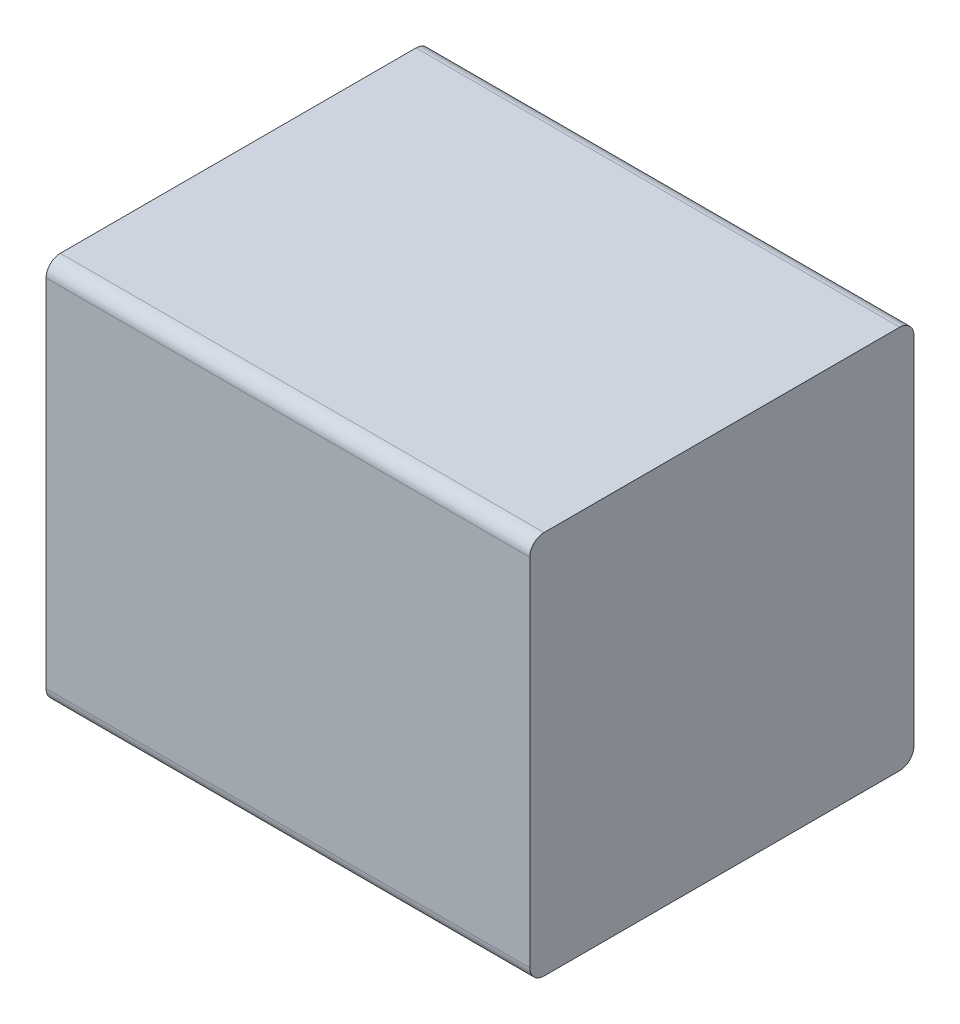
ISO-10303-21;
HEADER;
FILE_DESCRIPTION(('STEP AP214'),'2;1');
FILE_NAME('part.step','',(''),(''),'','','');
FILE_SCHEMA(('AUTOMOTIVE_DESIGN { 1 0 10303 214 1 1 1 1 }'));
ENDSEC;
DATA;
#1=APPLICATION_CONTEXT('core data for automotive mechanical design processes');
#2=APPLICATION_PROTOCOL_DEFINITION('international standard','automotive_design',2000,#1);
#3=PRODUCT_CONTEXT('',#1,'mechanical');
#4=PRODUCT('Part','Part','',(#3));
#5=PRODUCT_RELATED_PRODUCT_CATEGORY('part','',(#4));
#6=PRODUCT_DEFINITION_FORMATION('','',#4);
#7=PRODUCT_DEFINITION_CONTEXT('part definition',#1,'design');
#8=PRODUCT_DEFINITION('design','',#6,#7);
#9=PRODUCT_DEFINITION_SHAPE('','',#8);
#10=(LENGTH_UNIT() NAMED_UNIT(*) SI_UNIT(.MILLI.,.METRE.));
#11=(NAMED_UNIT(*) PLANE_ANGLE_UNIT() SI_UNIT($,.RADIAN.));
#12=(NAMED_UNIT(*) SI_UNIT($,.STERADIAN.) SOLID_ANGLE_UNIT());
#13=UNCERTAINTY_MEASURE_WITH_UNIT(LENGTH_MEASURE(1.E-05),#10,'distance_accuracy_value','');
#14=(GEOMETRIC_REPRESENTATION_CONTEXT(3) GLOBAL_UNCERTAINTY_ASSIGNED_CONTEXT((#13)) GLOBAL_UNIT_ASSIGNED_CONTEXT((#10,
#11,#12)) REPRESENTATION_CONTEXT('',''));
#15=CARTESIAN_POINT('',(0.,0.,0.));
#16=DIRECTION('',(0.,0.,1.));
#17=DIRECTION('',(1.,0.,0.));
#18=AXIS2_PLACEMENT_3D('',#15,#16,#17);
#19=CARTESIAN_POINT('',(0.,0.,0.));
#20=DIRECTION('',(0.,1.,0.));
#21=DIRECTION('',(1.,0.,0.));
#22=AXIS2_PLACEMENT_3D('',#19,#20,#21);
#23=PLANE('',#22);
#24=DIRECTION('',(0.,0.,1.));
#25=VECTOR('',#24,1.);
#26=CARTESIAN_POINT('',(1.9,0.,0.));
#27=LINE('',#26,#25);
#28=CARTESIAN_POINT('',(1.9,0.,0.05));
#29=VERTEX_POINT('',#28);
#30=CARTESIAN_POINT('',(1.9,0.,1.3));
#31=VERTEX_POINT('',#30);
#32=EDGE_CURVE('E11',#29,#31,#27,.T.);
#33=ORIENTED_EDGE('',*,*,#32,.T.);
#34=DIRECTION('',(1.,0.,0.));
#35=VECTOR('',#34,1.);
#36=CARTESIAN_POINT('',(0.,0.,1.3));
#37=LINE('',#36,#35);
#38=CARTESIAN_POINT('',(0.2,0.,1.3));
#39=VERTEX_POINT('',#38);
#40=EDGE_CURVE('E42',#39,#31,#37,.T.);
#41=ORIENTED_EDGE('',*,*,#40,.F.);
#42=DIRECTION('',(0.,0.,1.));
#43=VECTOR('',#42,1.);
#44=CARTESIAN_POINT('',(0.2,0.,0.));
#45=LINE('',#44,#43);
#46=CARTESIAN_POINT('',(0.2,0.,0.05));
#47=VERTEX_POINT('',#46);
#48=EDGE_CURVE('E184',#47,#39,#45,.T.);
#49=ORIENTED_EDGE('',*,*,#48,.F.);
#50=DIRECTION('',(1.,0.,0.));
#51=VECTOR('',#50,1.);
#52=CARTESIAN_POINT('',(0.,0.,0.05));
#53=LINE('',#52,#51);
#54=EDGE_CURVE('E28',#47,#29,#53,.T.);
#55=ORIENTED_EDGE('',*,*,#54,.T.);
#56=EDGE_LOOP('',(#33,#41,#49,#55));
#57=FACE_BOUND('',#56,.T.);
#58=ADVANCED_FACE('F17',(#57),#23,.F.);
#59=CARTESIAN_POINT('',(0.,0.05,0.05));
#60=DIRECTION('',(1.,0.,0.));
#61=DIRECTION('',(0.,-1.,0.));
#62=AXIS2_PLACEMENT_3D('',#59,#60,#61);
#63=CYLINDRICAL_SURFACE('',#62,0.05);
#64=ORIENTED_EDGE('',*,*,#54,.F.);
#65=CARTESIAN_POINT('',(0.2,0.05,0.05));
#66=DIRECTION('',(1.,0.,0.));
#67=DIRECTION('',(0.,-1.,0.));
#68=AXIS2_PLACEMENT_3D('',#65,#66,#67);
#69=CIRCLE('',#68,0.05);
#70=CARTESIAN_POINT('',(0.2,0.05,0.));
#71=VERTEX_POINT('',#70);
#72=EDGE_CURVE('E129',#47,#71,#69,.T.);
#73=ORIENTED_EDGE('',*,*,#72,.T.);
#74=DIRECTION('',(1.,0.,0.));
#75=VECTOR('',#74,1.);
#76=CARTESIAN_POINT('',(0.,0.05,0.));
#77=LINE('',#76,#75);
#78=CARTESIAN_POINT('',(1.9,0.05,0.));
#79=VERTEX_POINT('',#78);
#80=EDGE_CURVE('E125',#71,#79,#77,.T.);
#81=ORIENTED_EDGE('',*,*,#80,.T.);
#82=CARTESIAN_POINT('',(1.9,0.05,0.05));
#83=DIRECTION('',(1.,0.,0.));
#84=DIRECTION('',(0.,-1.,0.));
#85=AXIS2_PLACEMENT_3D('',#82,#83,#84);
#86=CIRCLE('',#85,0.05);
#87=EDGE_CURVE('E21',#29,#79,#86,.T.);
#88=ORIENTED_EDGE('',*,*,#87,.F.);
#89=EDGE_LOOP('',(#64,#73,#81,#88));
#90=FACE_BOUND('',#89,.T.);
#91=ADVANCED_FACE('F127',(#90),#63,.T.);
#92=CARTESIAN_POINT('',(1.9,0.,0.));
#93=DIRECTION('',(1.,0.,0.));
#94=DIRECTION('',(0.,1.,0.));
#95=AXIS2_PLACEMENT_3D('',#92,#93,#94);
#96=PLANE('',#95);
#97=ORIENTED_EDGE('',*,*,#32,.F.);
#98=ORIENTED_EDGE('',*,*,#87,.T.);
#99=DIRECTION('',(0.,1.,0.));
#100=VECTOR('',#99,1.);
#101=CARTESIAN_POINT('',(1.9,0.,0.));
#102=LINE('',#101,#100);
#103=CARTESIAN_POINT('',(1.9,1.3,0.));
#104=VERTEX_POINT('',#103);
#105=EDGE_CURVE('E119',#79,#104,#102,.T.);
#106=ORIENTED_EDGE('',*,*,#105,.T.);
#107=CARTESIAN_POINT('',(1.9,1.3,0.05));
#108=DIRECTION('',(1.,0.,0.));
#109=DIRECTION('',(0.,1.,0.));
#110=AXIS2_PLACEMENT_3D('',#107,#108,#109);
#111=CIRCLE('',#110,0.05);
#112=CARTESIAN_POINT('',(1.9,1.35,0.05));
#113=VERTEX_POINT('',#112);
#114=EDGE_CURVE('E139',#104,#113,#111,.T.);
#115=ORIENTED_EDGE('',*,*,#114,.T.);
#116=DIRECTION('',(0.,0.,1.));
#117=VECTOR('',#116,1.);
#118=CARTESIAN_POINT('',(1.9,1.35,0.));
#119=LINE('',#118,#117);
#120=CARTESIAN_POINT('',(1.9,1.35,1.3));
#121=VERTEX_POINT('',#120);
#122=EDGE_CURVE('E145',#113,#121,#119,.T.);
#123=ORIENTED_EDGE('',*,*,#122,.T.);
#124=CARTESIAN_POINT('',(1.9,1.3,1.3));
#125=DIRECTION('',(1.,0.,0.));
#126=DIRECTION('',(0.,1.,0.));
#127=AXIS2_PLACEMENT_3D('',#124,#125,#126);
#128=CIRCLE('',#127,0.05);
#129=CARTESIAN_POINT('',(1.9,1.3,1.35));
#130=VERTEX_POINT('',#129);
#131=EDGE_CURVE('E158',#121,#130,#128,.T.);
#132=ORIENTED_EDGE('',*,*,#131,.T.);
#133=DIRECTION('',(0.,1.,0.));
#134=VECTOR('',#133,1.);
#135=CARTESIAN_POINT('',(1.9,0.,1.35));
#136=LINE('',#135,#134);
#137=CARTESIAN_POINT('',(1.9,0.05,1.35));
#138=VERTEX_POINT('',#137);
#139=EDGE_CURVE('E154',#138,#130,#136,.T.);
#140=ORIENTED_EDGE('',*,*,#139,.F.);
#141=CARTESIAN_POINT('',(1.9,0.05,1.3));
#142=DIRECTION('',(1.,0.,0.));
#143=DIRECTION('',(0.,-1.,0.));
#144=AXIS2_PLACEMENT_3D('',#141,#142,#143);
#145=CIRCLE('',#144,0.05);
#146=EDGE_CURVE('E193',#138,#31,#145,.T.);
#147=ORIENTED_EDGE('',*,*,#146,.T.);
#148=EDGE_LOOP('',(#97,#98,#106,#115,#123,#132,#140,#147));
#149=FACE_BOUND('',#148,.T.);
#150=ADVANCED_FACE('F116',(#149),#96,.T.);
#151=CARTESIAN_POINT('',(0.,0.05,1.3));
#152=DIRECTION('',(1.,0.,0.));
#153=DIRECTION('',(0.,-1.,0.));
#154=AXIS2_PLACEMENT_3D('',#151,#152,#153);
#155=CYLINDRICAL_SURFACE('',#154,0.05);
#156=ORIENTED_EDGE('',*,*,#40,.T.);
#157=ORIENTED_EDGE('',*,*,#146,.F.);
#158=DIRECTION('',(1.,0.,0.));
#159=VECTOR('',#158,1.);
#160=CARTESIAN_POINT('',(0.,0.05,1.35));
#161=LINE('',#160,#159);
#162=CARTESIAN_POINT('',(0.2,0.05,1.35));
#163=VERTEX_POINT('',#162);
#164=EDGE_CURVE('E150',#163,#138,#161,.T.);
#165=ORIENTED_EDGE('',*,*,#164,.F.);
#166=CARTESIAN_POINT('',(0.2,0.05,1.3));
#167=DIRECTION('',(1.,0.,0.));
#168=DIRECTION('',(0.,-1.,0.));
#169=AXIS2_PLACEMENT_3D('',#166,#167,#168);
#170=CIRCLE('',#169,0.05);
#171=EDGE_CURVE('E176',#163,#39,#170,.T.);
#172=ORIENTED_EDGE('',*,*,#171,.T.);
#173=EDGE_LOOP('',(#156,#157,#165,#172));
#174=FACE_BOUND('',#173,.T.);
#175=ADVANCED_FACE('F230',(#174),#155,.T.);
#176=CARTESIAN_POINT('',(0.2,0.,0.));
#177=DIRECTION('',(1.,0.,0.));
#178=DIRECTION('',(0.,1.,0.));
#179=AXIS2_PLACEMENT_3D('',#176,#177,#178);
#180=PLANE('',#179);
#181=ORIENTED_EDGE('',*,*,#171,.F.);
#182=DIRECTION('',(0.,1.,0.));
#183=VECTOR('',#182,1.);
#184=CARTESIAN_POINT('',(0.2,0.,1.35));
#185=LINE('',#184,#183);
#186=CARTESIAN_POINT('',(0.2,1.3,1.35));
#187=VERTEX_POINT('',#186);
#188=EDGE_CURVE('E179',#163,#187,#185,.T.);
#189=ORIENTED_EDGE('',*,*,#188,.T.);
#190=CARTESIAN_POINT('',(0.2,1.3,1.3));
#191=DIRECTION('',(1.,0.,0.));
#192=DIRECTION('',(0.,1.,0.));
#193=AXIS2_PLACEMENT_3D('',#190,#191,#192);
#194=CIRCLE('',#193,0.05);
#195=CARTESIAN_POINT('',(0.2,1.35,1.3));
#196=VERTEX_POINT('',#195);
#197=EDGE_CURVE('E75',#196,#187,#194,.T.);
#198=ORIENTED_EDGE('',*,*,#197,.F.);
#199=DIRECTION('',(0.,0.,1.));
#200=VECTOR('',#199,1.);
#201=CARTESIAN_POINT('',(0.2,1.35,0.));
#202=LINE('',#201,#200);
#203=CARTESIAN_POINT('',(0.2,1.35,0.05));
#204=VERTEX_POINT('',#203);
#205=EDGE_CURVE('E87',#204,#196,#202,.T.);
#206=ORIENTED_EDGE('',*,*,#205,.F.);
#207=CARTESIAN_POINT('',(0.2,1.3,0.05));
#208=DIRECTION('',(1.,0.,0.));
#209=DIRECTION('',(0.,1.,0.));
#210=AXIS2_PLACEMENT_3D('',#207,#208,#209);
#211=CIRCLE('',#210,0.05);
#212=CARTESIAN_POINT('',(0.2,1.3,0.));
#213=VERTEX_POINT('',#212);
#214=EDGE_CURVE('E180',#213,#204,#211,.T.);
#215=ORIENTED_EDGE('',*,*,#214,.F.);
#216=DIRECTION('',(0.,1.,0.));
#217=VECTOR('',#216,1.);
#218=CARTESIAN_POINT('',(0.2,0.,0.));
#219=LINE('',#218,#217);
#220=EDGE_CURVE('E153',#71,#213,#219,.T.);
#221=ORIENTED_EDGE('',*,*,#220,.F.);
#222=ORIENTED_EDGE('',*,*,#72,.F.);
#223=ORIENTED_EDGE('',*,*,#48,.T.);
#224=EDGE_LOOP('',(#181,#189,#198,#206,#215,#221,#222,#223));
#225=FACE_BOUND('',#224,.T.);
#226=ADVANCED_FACE('F227',(#225),#180,.F.);
#227=CARTESIAN_POINT('',(0.,0.,0.));
#228=DIRECTION('',(0.,0.,1.));
#229=DIRECTION('',(1.,0.,0.));
#230=AXIS2_PLACEMENT_3D('',#227,#228,#229);
#231=PLANE('',#230);
#232=DIRECTION('',(1.,0.,0.));
#233=VECTOR('',#232,1.);
#234=CARTESIAN_POINT('',(0.,1.3,0.));
#235=LINE('',#234,#233);
#236=EDGE_CURVE('E137',#213,#104,#235,.T.);
#237=ORIENTED_EDGE('',*,*,#236,.T.);
#238=ORIENTED_EDGE('',*,*,#105,.F.);
#239=ORIENTED_EDGE('',*,*,#80,.F.);
#240=ORIENTED_EDGE('',*,*,#220,.T.);
#241=EDGE_LOOP('',(#237,#238,#239,#240));
#242=FACE_BOUND('',#241,.T.);
#243=ADVANCED_FACE('F135',(#242),#231,.F.);
#244=CARTESIAN_POINT('',(0.,0.,1.35));
#245=DIRECTION('',(0.,0.,1.));
#246=DIRECTION('',(1.,0.,0.));
#247=AXIS2_PLACEMENT_3D('',#244,#245,#246);
#248=PLANE('',#247);
#249=ORIENTED_EDGE('',*,*,#188,.F.);
#250=ORIENTED_EDGE('',*,*,#164,.T.);
#251=ORIENTED_EDGE('',*,*,#139,.T.);
#252=DIRECTION('',(1.,0.,0.));
#253=VECTOR('',#252,1.);
#254=CARTESIAN_POINT('',(0.,1.3,1.35));
#255=LINE('',#254,#253);
#256=EDGE_CURVE('E161',#187,#130,#255,.T.);
#257=ORIENTED_EDGE('',*,*,#256,.F.);
#258=EDGE_LOOP('',(#249,#250,#251,#257));
#259=FACE_BOUND('',#258,.T.);
#260=ADVANCED_FACE('F208',(#259),#248,.T.);
#261=CARTESIAN_POINT('',(0.,1.3,1.3));
#262=DIRECTION('',(1.,0.,0.));
#263=DIRECTION('',(0.,1.,0.));
#264=AXIS2_PLACEMENT_3D('',#261,#262,#263);
#265=CYLINDRICAL_SURFACE('',#264,0.05);
#266=DIRECTION('',(1.,0.,0.));
#267=VECTOR('',#266,1.);
#268=CARTESIAN_POINT('',(0.,1.35,1.3));
#269=LINE('',#268,#267);
#270=EDGE_CURVE('E171',#196,#121,#269,.T.);
#271=ORIENTED_EDGE('',*,*,#270,.F.);
#272=ORIENTED_EDGE('',*,*,#197,.T.);
#273=ORIENTED_EDGE('',*,*,#256,.T.);
#274=ORIENTED_EDGE('',*,*,#131,.F.);
#275=EDGE_LOOP('',(#271,#272,#273,#274));
#276=FACE_BOUND('',#275,.T.);
#277=ADVANCED_FACE('F206',(#276),#265,.T.);
#278=CARTESIAN_POINT('',(0.,1.35,0.));
#279=DIRECTION('',(0.,1.,0.));
#280=DIRECTION('',(1.,0.,0.));
#281=AXIS2_PLACEMENT_3D('',#278,#279,#280);
#282=PLANE('',#281);
#283=DIRECTION('',(1.,0.,0.));
#284=VECTOR('',#283,1.);
#285=CARTESIAN_POINT('',(0.,1.35,0.05));
#286=LINE('',#285,#284);
#287=EDGE_CURVE('E182',#204,#113,#286,.T.);
#288=ORIENTED_EDGE('',*,*,#287,.F.);
#289=ORIENTED_EDGE('',*,*,#205,.T.);
#290=ORIENTED_EDGE('',*,*,#270,.T.);
#291=ORIENTED_EDGE('',*,*,#122,.F.);
#292=EDGE_LOOP('',(#288,#289,#290,#291));
#293=FACE_BOUND('',#292,.T.);
#294=ADVANCED_FACE('F205',(#293),#282,.T.);
#295=CARTESIAN_POINT('',(0.,1.3,0.05));
#296=DIRECTION('',(1.,0.,0.));
#297=DIRECTION('',(0.,1.,0.));
#298=AXIS2_PLACEMENT_3D('',#295,#296,#297);
#299=CYLINDRICAL_SURFACE('',#298,0.05);
#300=ORIENTED_EDGE('',*,*,#287,.T.);
#301=ORIENTED_EDGE('',*,*,#114,.F.);
#302=ORIENTED_EDGE('',*,*,#236,.F.);
#303=ORIENTED_EDGE('',*,*,#214,.T.);
#304=EDGE_LOOP('',(#300,#301,#302,#303));
#305=FACE_BOUND('',#304,.T.);
#306=ADVANCED_FACE('F19',(#305),#299,.T.);
#307=CLOSED_SHELL('',(#58,#91,#150,#175,#226,#243,#260,#277,#294,#306));
#308=MANIFOLD_SOLID_BREP('B1',#307);
#309=ADVANCED_BREP_SHAPE_REPRESENTATION('',(#18,#308),#14);
#310=SHAPE_DEFINITION_REPRESENTATION(#9,#309);
ENDSEC;
END-ISO-10303-21;
